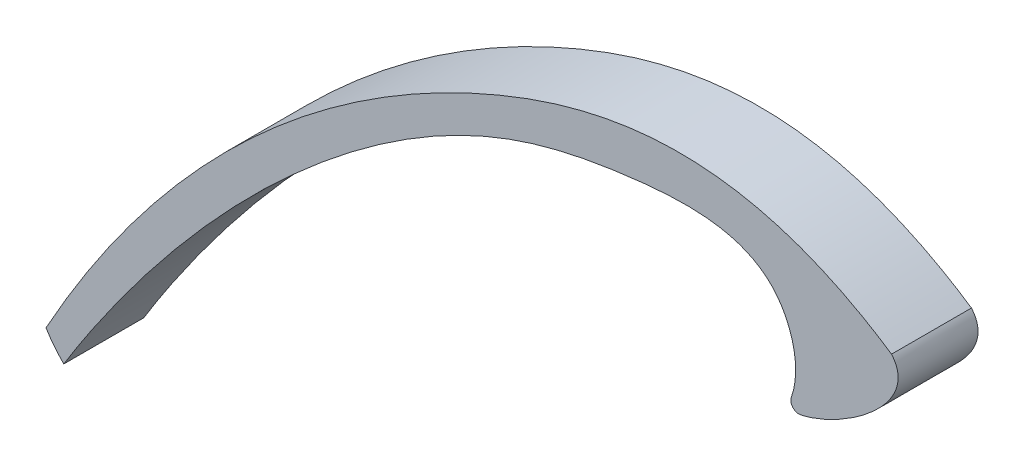
ISO-10303-21;
HEADER;
FILE_DESCRIPTION(('STEP AP214'),'2;1');
FILE_NAME('part.step','',(''),(''),'','','');
FILE_SCHEMA(('AUTOMOTIVE_DESIGN { 1 0 10303 214 1 1 1 1 }'));
ENDSEC;
DATA;
#1=APPLICATION_CONTEXT('core data for automotive mechanical design processes');
#2=APPLICATION_PROTOCOL_DEFINITION('international standard','automotive_design',2000,#1);
#3=PRODUCT_CONTEXT('',#1,'mechanical');
#4=PRODUCT('Part','Part','',(#3));
#5=PRODUCT_RELATED_PRODUCT_CATEGORY('part','',(#4));
#6=PRODUCT_DEFINITION_FORMATION('','',#4);
#7=PRODUCT_DEFINITION_CONTEXT('part definition',#1,'design');
#8=PRODUCT_DEFINITION('design','',#6,#7);
#9=PRODUCT_DEFINITION_SHAPE('','',#8);
#10=(LENGTH_UNIT() NAMED_UNIT(*) SI_UNIT(.MILLI.,.METRE.));
#11=(NAMED_UNIT(*) PLANE_ANGLE_UNIT() SI_UNIT($,.RADIAN.));
#12=(NAMED_UNIT(*) SI_UNIT($,.STERADIAN.) SOLID_ANGLE_UNIT());
#13=UNCERTAINTY_MEASURE_WITH_UNIT(LENGTH_MEASURE(1.E-05),#10,'distance_accuracy_value','');
#14=(GEOMETRIC_REPRESENTATION_CONTEXT(3) GLOBAL_UNCERTAINTY_ASSIGNED_CONTEXT((#13)) GLOBAL_UNIT_ASSIGNED_CONTEXT((#10,
#11,#12)) REPRESENTATION_CONTEXT('',''));
#15=CARTESIAN_POINT('',(0.,0.,0.));
#16=DIRECTION('',(0.,0.,1.));
#17=DIRECTION('',(1.,0.,0.));
#18=AXIS2_PLACEMENT_3D('',#15,#16,#17);
#19=CARTESIAN_POINT('',(-295.297632106763,239.635279568671,5.));
#20=CARTESIAN_POINT('',(-294.703181850947,230.070649134072,5.));
#21=CARTESIAN_POINT('',(-287.625269042427,225.886451500211,5.));
#22=B_SPLINE_CURVE_WITH_KNOTS('',2,(#19,#20,#21),.UNSPECIFIED.,.F.,.F.,(3,3),(0.,1.),.UNSPECIFIED.);
#23=DIRECTION('',(0.,0.,-1.));
#24=VECTOR('',#23,1.);
#25=SURFACE_OF_LINEAR_EXTRUSION('',#22,#24);
#26=DIRECTION('',(0.,0.,-1.));
#27=VECTOR('',#26,1.);
#28=CARTESIAN_POINT('',(-290.590953302353,228.147328953587,15.));
#29=LINE('',#28,#27);
#30=CARTESIAN_POINT('',(-290.590953302353,228.147328953587,5.));
#31=VERTEX_POINT('',#30);
#32=CARTESIAN_POINT('',(-290.590953302414,228.147328953533,-5.));
#33=VERTEX_POINT('',#32);
#34=EDGE_CURVE('E86',#31,#33,#29,.T.);
#35=ORIENTED_EDGE('',*,*,#34,.F.);
#36=CARTESIAN_POINT('',(-292.817022104417,230.959568629807,5.));
#37=VERTEX_POINT('',#36);
#38=EDGE_CURVE('E95',#37,#31,#22,.T.);
#39=ORIENTED_EDGE('',*,*,#38,.F.);
#40=DIRECTION('',(0.,0.,-1.));
#41=VECTOR('',#40,1.);
#42=CARTESIAN_POINT('',(-292.817022104417,230.959568629807,5.));
#43=LINE('',#42,#41);
#44=CARTESIAN_POINT('',(-292.817022104417,230.959568629807,-5.));
#45=VERTEX_POINT('',#44);
#46=EDGE_CURVE('E105',#37,#45,#43,.T.);
#47=ORIENTED_EDGE('',*,*,#46,.T.);
#48=CARTESIAN_POINT('',(-295.297632106763,239.635279568671,-5.));
#49=CARTESIAN_POINT('',(-294.703181850947,230.070649134072,-5.));
#50=CARTESIAN_POINT('',(-287.625269042427,225.886451500211,-5.));
#51=B_SPLINE_CURVE_WITH_KNOTS('',2,(#48,#49,#50),.UNSPECIFIED.,.F.,.F.,(3,3),(0.,1.),.UNSPECIFIED.);
#52=EDGE_CURVE('E98',#45,#33,#51,.T.);
#53=ORIENTED_EDGE('',*,*,#52,.T.);
#54=EDGE_LOOP('',(#35,#39,#47,#53));
#55=FACE_BOUND('',#54,.T.);
#56=ADVANCED_FACE('F40',(#55),#25,.F.);
#57=CARTESIAN_POINT('',(0.,0.,5.));
#58=DIRECTION('',(0.,0.,1.));
#59=DIRECTION('',(1.,0.,0.));
#60=AXIS2_PLACEMENT_3D('',#57,#58,#59);
#61=PLANE('',#60);
#62=CARTESIAN_POINT('',(-200.229269231954,268.655423213523,5.));
#63=CARTESIAN_POINT('',(-197.997136713452,272.340391732493,5.));
#64=CARTESIAN_POINT('',(-200.481533448088,285.093301357906,5.));
#65=CARTESIAN_POINT('',(-219.239801340776,284.380312267773,5.));
#66=CARTESIAN_POINT('',(-236.817722683464,280.744930994277,5.));
#67=CARTESIAN_POINT('',(-263.967238021457,264.674207252078,5.));
#68=CARTESIAN_POINT('',(-282.162851045407,241.847562630138,5.));
#69=CARTESIAN_POINT('',(-290.590953302353,228.147328953587,5.));
#70=B_SPLINE_CURVE_WITH_KNOTS('',3,(#62,#63,#64,#65,#66,#67,#68,#69),.UNSPECIFIED.,.F.,.F.,(4,1,
1,1,1,4),(0.,0.103111546915874,0.245202877280726,0.372429736309106,0.555445320445691,1.),.UNSPECIFIED.);
#71=CARTESIAN_POINT('',(-199.562190123263,270.054218324506,5.));
#72=VERTEX_POINT('',#71);
#73=EDGE_CURVE('E83',#31,#72,#70,.F.);
#74=ORIENTED_EDGE('',*,*,#73,.T.);
#75=CARTESIAN_POINT('',(-198.622282576275,269.712789264358,5.));
#76=DIRECTION('',(0.,0.,1.));
#77=DIRECTION('',(1.,0.,0.));
#78=AXIS2_PLACEMENT_3D('',#75,#76,#77);
#79=CIRCLE('',#78,1.);
#80=CARTESIAN_POINT('',(-198.429225936677,268.731601650337,5.));
#81=VERTEX_POINT('',#80);
#82=EDGE_CURVE('E11',#72,#81,#79,.T.);
#83=ORIENTED_EDGE('',*,*,#82,.T.);
#84=CARTESIAN_POINT('',(-187.019986371541,280.997877447247,5.));
#85=CARTESIAN_POINT('',(-186.559670758341,280.462502314302,5.));
#86=CARTESIAN_POINT('',(-184.229279466509,275.176515905615,5.));
#87=CARTESIAN_POINT('',(-196.567908783182,267.94964416205,5.));
#88=CARTESIAN_POINT('',(-200.229269231954,268.655423213523,5.));
#89=B_SPLINE_CURVE_WITH_KNOTS('',3,(#84,#85,#86,#87,#88),.UNSPECIFIED.,.F.,.F.,(4,1,4),
(0.123396326010415,0.218579713415603,1.),.UNSPECIFIED.);
#90=CARTESIAN_POINT('',(-187.019986371541,280.997877447247,5.));
#91=VERTEX_POINT('',#90);
#92=EDGE_CURVE('E109',#91,#81,#89,.T.);
#93=ORIENTED_EDGE('',*,*,#92,.F.);
#94=CARTESIAN_POINT('',(-292.817022104416,230.959568629806,5.));
#95=CARTESIAN_POINT('',(-279.371305124867,255.218678457654,5.));
#96=CARTESIAN_POINT('',(-248.405916062326,286.070404634132,5.));
#97=CARTESIAN_POINT('',(-205.470098812024,293.353762035251,5.));
#98=CARTESIAN_POINT('',(-187.019986371541,280.997877447247,5.));
#99=B_SPLINE_CURVE_WITH_KNOTS('',3,(#94,#95,#96,#97,#98),.UNSPECIFIED.,.F.,.F.,(4,1,4),(0.,
0.593504623180425,0.977243459732475),.UNSPECIFIED.);
#100=EDGE_CURVE('E104',#37,#91,#99,.T.);
#101=ORIENTED_EDGE('',*,*,#100,.F.);
#102=ORIENTED_EDGE('',*,*,#38,.T.);
#103=EDGE_LOOP('',(#74,#83,#93,#101,#102));
#104=FACE_BOUND('',#103,.T.);
#105=ADVANCED_FACE('F101',(#104),#61,.T.);
#106=CARTESIAN_POINT('',(0.,0.,-5.));
#107=DIRECTION('',(0.,0.,1.));
#108=DIRECTION('',(1.,0.,0.));
#109=AXIS2_PLACEMENT_3D('',#106,#107,#108);
#110=PLANE('',#109);
#111=CARTESIAN_POINT('',(-187.019986371541,280.997877447247,-5.));
#112=CARTESIAN_POINT('',(-186.559670758341,280.462502314302,-5.));
#113=CARTESIAN_POINT('',(-184.229279466509,275.176515905615,-5.));
#114=CARTESIAN_POINT('',(-196.567908783182,267.94964416205,-5.));
#115=CARTESIAN_POINT('',(-200.229269231954,268.655423213523,-5.));
#116=B_SPLINE_CURVE_WITH_KNOTS('',3,(#111,#112,#113,#114,#115),.UNSPECIFIED.,.F.,.F.,(4,1,4),
(0.123396326010415,0.218579713415603,1.),.UNSPECIFIED.);
#117=CARTESIAN_POINT('',(-187.019986371541,280.997877447247,-5.));
#118=VERTEX_POINT('',#117);
#119=CARTESIAN_POINT('',(-198.429225936677,268.731601650337,-5.));
#120=VERTEX_POINT('',#119);
#121=EDGE_CURVE('E91',#118,#120,#116,.T.);
#122=ORIENTED_EDGE('',*,*,#121,.T.);
#123=CARTESIAN_POINT('',(-198.622282576275,269.712789264358,-5.));
#124=DIRECTION('',(0.,0.,1.));
#125=DIRECTION('',(1.,0.,0.));
#126=AXIS2_PLACEMENT_3D('',#123,#124,#125);
#127=CIRCLE('',#126,1.);
#128=CARTESIAN_POINT('',(-199.562190123263,270.054218324506,-5.));
#129=VERTEX_POINT('',#128);
#130=EDGE_CURVE('E62',#120,#129,#127,.F.);
#131=ORIENTED_EDGE('',*,*,#130,.T.);
#132=CARTESIAN_POINT('',(-200.229269231954,268.655423213523,-5.));
#133=CARTESIAN_POINT('',(-197.997136713452,272.340391732493,-5.));
#134=CARTESIAN_POINT('',(-200.481533448088,285.093301357906,-5.));
#135=CARTESIAN_POINT('',(-219.239801340776,284.380312267773,-5.));
#136=CARTESIAN_POINT('',(-236.817722683464,280.744930994277,-5.));
#137=CARTESIAN_POINT('',(-263.967238021457,264.674207252078,-5.));
#138=CARTESIAN_POINT('',(-282.162851045407,241.847562630138,-5.));
#139=CARTESIAN_POINT('',(-290.590953302353,228.147328953587,-5.));
#140=B_SPLINE_CURVE_WITH_KNOTS('',3,(#132,#133,#134,#135,#136,#137,#138,#139),.UNSPECIFIED.,.F.,
.F.,(4,1,1,1,1,4),(0.,0.103111546915874,0.245202877280726,0.372429736309106,0.555445320445691,
1.),.UNSPECIFIED.);
#141=EDGE_CURVE('E99',#129,#33,#140,.T.);
#142=ORIENTED_EDGE('',*,*,#141,.T.);
#143=ORIENTED_EDGE('',*,*,#52,.F.);
#144=CARTESIAN_POINT('',(-292.817022104416,230.959568629806,-5.));
#145=CARTESIAN_POINT('',(-279.371305124867,255.218678457654,-5.));
#146=CARTESIAN_POINT('',(-248.405916062326,286.070404634132,-5.));
#147=CARTESIAN_POINT('',(-205.470098812024,293.353762035251,-5.));
#148=CARTESIAN_POINT('',(-187.019986371541,280.997877447247,-5.));
#149=B_SPLINE_CURVE_WITH_KNOTS('',3,(#144,#145,#146,#147,#148),.UNSPECIFIED.,.F.,.F.,(4,1,4),
(0.,0.593504623180425,0.977243459732475),.UNSPECIFIED.);
#150=EDGE_CURVE('E159',#45,#118,#149,.T.);
#151=ORIENTED_EDGE('',*,*,#150,.T.);
#152=EDGE_LOOP('',(#122,#131,#142,#143,#151));
#153=FACE_BOUND('',#152,.T.);
#154=ADVANCED_FACE('F129',(#153),#110,.F.);
#155=DIRECTION('',(0.,0.,-1.));
#156=VECTOR('',#155,1.);
#157=SURFACE_OF_LINEAR_EXTRUSION('',#89,#156);
#158=ORIENTED_EDGE('',*,*,#92,.T.);
#159=DIRECTION('',(0.,0.,-1.));
#160=VECTOR('',#159,1.);
#161=CARTESIAN_POINT('',(-198.429225936677,268.731601650337,5.));
#162=LINE('',#161,#160);
#163=EDGE_CURVE('E152',#81,#120,#162,.T.);
#164=ORIENTED_EDGE('',*,*,#163,.T.);
#165=ORIENTED_EDGE('',*,*,#121,.F.);
#166=DIRECTION('',(0.,0.,-1.));
#167=VECTOR('',#166,1.);
#168=CARTESIAN_POINT('',(-187.019986371541,280.997877447247,5.));
#169=LINE('',#168,#167);
#170=EDGE_CURVE('E107',#91,#118,#169,.T.);
#171=ORIENTED_EDGE('',*,*,#170,.F.);
#172=EDGE_LOOP('',(#158,#164,#165,#171));
#173=FACE_BOUND('',#172,.T.);
#174=ADVANCED_FACE('F133',(#173),#157,.T.);
#175=DIRECTION('',(0.,0.,-1.));
#176=VECTOR('',#175,1.);
#177=SURFACE_OF_LINEAR_EXTRUSION('',#99,#176);
#178=ORIENTED_EDGE('',*,*,#150,.F.);
#179=ORIENTED_EDGE('',*,*,#46,.F.);
#180=ORIENTED_EDGE('',*,*,#100,.T.);
#181=ORIENTED_EDGE('',*,*,#170,.T.);
#182=EDGE_LOOP('',(#178,#179,#180,#181));
#183=FACE_BOUND('',#182,.T.);
#184=ADVANCED_FACE('F131',(#183),#177,.T.);
#185=CARTESIAN_POINT('',(-200.229269231954,268.655423213523,15.));
#186=CARTESIAN_POINT('',(-197.997136713452,272.340391732493,15.));
#187=CARTESIAN_POINT('',(-200.481533448088,285.093301357906,15.));
#188=CARTESIAN_POINT('',(-219.239801340776,284.380312267773,15.));
#189=CARTESIAN_POINT('',(-236.817722683464,280.744930994277,15.));
#190=CARTESIAN_POINT('',(-263.967238021457,264.674207252078,15.));
#191=CARTESIAN_POINT('',(-282.162851045407,241.847562630138,15.));
#192=CARTESIAN_POINT('',(-290.590953302353,228.147328953587,15.));
#193=B_SPLINE_CURVE_WITH_KNOTS('',3,(#185,#186,#187,#188,#189,#190,#191,#192),.UNSPECIFIED.,.F.,
.F.,(4,1,1,1,1,4),(0.,0.103111546915874,0.245202877280726,0.372429736309106,0.555445320445691,
1.),.UNSPECIFIED.);
#194=DIRECTION('',(0.,0.,-1.));
#195=VECTOR('',#194,1.);
#196=SURFACE_OF_LINEAR_EXTRUSION('',#193,#195);
#197=ORIENTED_EDGE('',*,*,#141,.F.);
#198=DIRECTION('',(0.,0.,-1.));
#199=VECTOR('',#198,1.);
#200=CARTESIAN_POINT('',(-199.562190123263,270.054218324506,-5.));
#201=LINE('',#200,#199);
#202=EDGE_CURVE('E48',#129,#72,#201,.F.);
#203=ORIENTED_EDGE('',*,*,#202,.T.);
#204=ORIENTED_EDGE('',*,*,#73,.F.);
#205=ORIENTED_EDGE('',*,*,#34,.T.);
#206=EDGE_LOOP('',(#197,#203,#204,#205));
#207=FACE_BOUND('',#206,.T.);
#208=ADVANCED_FACE('F85',(#207),#196,.T.);
#209=CARTESIAN_POINT('',(-198.622282576275,269.712789264358,0.));
#210=DIRECTION('',(0.,0.,-1.));
#211=DIRECTION('',(-1.,0.,0.));
#212=AXIS2_PLACEMENT_3D('',#209,#210,#211);
#213=CYLINDRICAL_SURFACE('',#212,1.);
#214=ORIENTED_EDGE('',*,*,#82,.F.);
#215=ORIENTED_EDGE('',*,*,#202,.F.);
#216=ORIENTED_EDGE('',*,*,#130,.F.);
#217=ORIENTED_EDGE('',*,*,#163,.F.);
#218=EDGE_LOOP('',(#214,#215,#216,#217));
#219=FACE_BOUND('',#218,.T.);
#220=ADVANCED_FACE('F42',(#219),#213,.T.);
#221=CLOSED_SHELL('',(#56,#105,#154,#174,#184,#208,#220));
#222=MANIFOLD_SOLID_BREP('B2',#221);
#223=ADVANCED_BREP_SHAPE_REPRESENTATION('',(#18,#222),#14);
#224=SHAPE_DEFINITION_REPRESENTATION(#9,#223);
ENDSEC;
END-ISO-10303-21;
